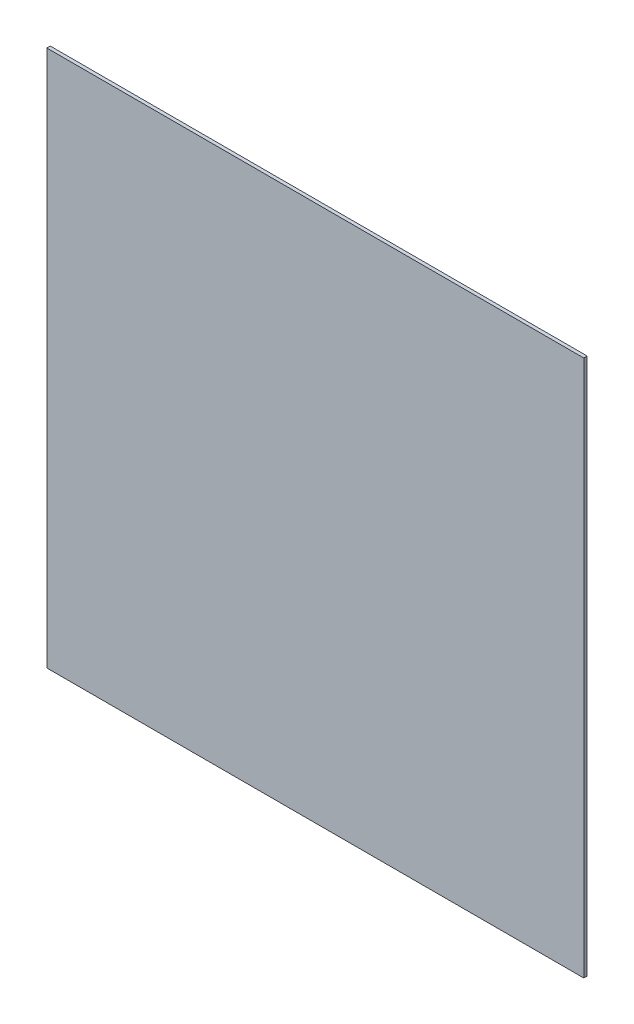
ISO-10303-21;
HEADER;
FILE_DESCRIPTION(('STEP AP214'),'2;1');
FILE_NAME('part.step','',(''),(''),'','','');
FILE_SCHEMA(('AUTOMOTIVE_DESIGN { 1 0 10303 214 1 1 1 1 }'));
ENDSEC;
DATA;
#1=APPLICATION_CONTEXT('core data for automotive mechanical design processes');
#2=APPLICATION_PROTOCOL_DEFINITION('international standard','automotive_design',2000,#1);
#3=PRODUCT_CONTEXT('',#1,'mechanical');
#4=PRODUCT('Part','Part','',(#3));
#5=PRODUCT_RELATED_PRODUCT_CATEGORY('part','',(#4));
#6=PRODUCT_DEFINITION_FORMATION('','',#4);
#7=PRODUCT_DEFINITION_CONTEXT('part definition',#1,'design');
#8=PRODUCT_DEFINITION('design','',#6,#7);
#9=PRODUCT_DEFINITION_SHAPE('','',#8);
#10=(LENGTH_UNIT() NAMED_UNIT(*) SI_UNIT(.MILLI.,.METRE.));
#11=(NAMED_UNIT(*) PLANE_ANGLE_UNIT() SI_UNIT($,.RADIAN.));
#12=(NAMED_UNIT(*) SI_UNIT($,.STERADIAN.) SOLID_ANGLE_UNIT());
#13=UNCERTAINTY_MEASURE_WITH_UNIT(LENGTH_MEASURE(1.E-05),#10,'distance_accuracy_value','');
#14=(GEOMETRIC_REPRESENTATION_CONTEXT(3) GLOBAL_UNCERTAINTY_ASSIGNED_CONTEXT((#13)) GLOBAL_UNIT_ASSIGNED_CONTEXT((#10,
#11,#12)) REPRESENTATION_CONTEXT('',''));
#15=CARTESIAN_POINT('',(0.,0.,0.));
#16=DIRECTION('',(0.,0.,1.));
#17=DIRECTION('',(1.,0.,0.));
#18=AXIS2_PLACEMENT_3D('',#15,#16,#17);
#19=CARTESIAN_POINT('',(1597.20489391915,-84.2433515912552,3.));
#20=DIRECTION('',(-1.,0.,0.));
#21=DIRECTION('',(0.,0.,1.));
#22=AXIS2_PLACEMENT_3D('',#19,#20,#21);
#23=PLANE('',#22);
#24=DIRECTION('',(0.,1.,0.));
#25=VECTOR('',#24,1.);
#26=CARTESIAN_POINT('',(1597.20489391915,-84.2433515912552,0.));
#27=LINE('',#26,#25);
#28=CARTESIAN_POINT('',(1597.20489391915,-554.143351591255,0.));
#29=VERTEX_POINT('',#28);
#30=CARTESIAN_POINT('',(1597.20489391915,-84.2433515912552,0.));
#31=VERTEX_POINT('',#30);
#32=EDGE_CURVE('E100',#29,#31,#27,.T.);
#33=ORIENTED_EDGE('',*,*,#32,.T.);
#34=DIRECTION('',(0.,0.,-1.));
#35=VECTOR('',#34,1.);
#36=CARTESIAN_POINT('',(1597.20489391915,-84.2433515912552,3.));
#37=LINE('',#36,#35);
#38=CARTESIAN_POINT('',(1597.20489391915,-84.2433515912552,3.));
#39=VERTEX_POINT('',#38);
#40=EDGE_CURVE('E11',#39,#31,#37,.T.);
#41=ORIENTED_EDGE('',*,*,#40,.F.);
#42=DIRECTION('',(0.,1.,0.));
#43=VECTOR('',#42,1.);
#44=CARTESIAN_POINT('',(1597.20489391915,-84.2433515912552,3.));
#45=LINE('',#44,#43);
#46=CARTESIAN_POINT('',(1597.20489391915,-554.143351591255,3.));
#47=VERTEX_POINT('',#46);
#48=EDGE_CURVE('E88',#47,#39,#45,.T.);
#49=ORIENTED_EDGE('',*,*,#48,.F.);
#50=DIRECTION('',(0.,0.,-1.));
#51=VECTOR('',#50,1.);
#52=CARTESIAN_POINT('',(1597.20489391915,-554.143351591255,3.));
#53=LINE('',#52,#51);
#54=EDGE_CURVE('E96',#47,#29,#53,.T.);
#55=ORIENTED_EDGE('',*,*,#54,.T.);
#56=EDGE_LOOP('',(#33,#41,#49,#55));
#57=FACE_BOUND('',#56,.T.);
#58=ADVANCED_FACE('F37',(#57),#23,.F.);
#59=CARTESIAN_POINT('',(1597.20489391915,-84.2433515912552,3.));
#60=DIRECTION('',(0.,-1.,0.));
#61=DIRECTION('',(0.,0.,-1.));
#62=AXIS2_PLACEMENT_3D('',#59,#60,#61);
#63=PLANE('',#62);
#64=DIRECTION('',(-1.,0.,0.));
#65=VECTOR('',#64,1.);
#66=CARTESIAN_POINT('',(1597.20489391915,-84.2433515912552,0.));
#67=LINE('',#66,#65);
#68=CARTESIAN_POINT('',(1127.30489391915,-84.2433515912552,0.));
#69=VERTEX_POINT('',#68);
#70=EDGE_CURVE('E92',#31,#69,#67,.T.);
#71=ORIENTED_EDGE('',*,*,#70,.T.);
#72=DIRECTION('',(0.,0.,-1.));
#73=VECTOR('',#72,1.);
#74=CARTESIAN_POINT('',(1127.30489391915,-84.2433515912552,3.));
#75=LINE('',#74,#73);
#76=CARTESIAN_POINT('',(1127.30489391915,-84.2433515912552,3.));
#77=VERTEX_POINT('',#76);
#78=EDGE_CURVE('E45',#77,#69,#75,.T.);
#79=ORIENTED_EDGE('',*,*,#78,.F.);
#80=DIRECTION('',(-1.,0.,0.));
#81=VECTOR('',#80,1.);
#82=CARTESIAN_POINT('',(1597.20489391915,-84.2433515912552,3.));
#83=LINE('',#82,#81);
#84=EDGE_CURVE('E83',#39,#77,#83,.T.);
#85=ORIENTED_EDGE('',*,*,#84,.F.);
#86=ORIENTED_EDGE('',*,*,#40,.T.);
#87=EDGE_LOOP('',(#71,#79,#85,#86));
#88=FACE_BOUND('',#87,.T.);
#89=ADVANCED_FACE('F91',(#88),#63,.F.);
#90=CARTESIAN_POINT('',(1127.30489391915,-84.2433515912552,3.));
#91=DIRECTION('',(1.,0.,0.));
#92=DIRECTION('',(0.,0.,-1.));
#93=AXIS2_PLACEMENT_3D('',#90,#91,#92);
#94=PLANE('',#93);
#95=DIRECTION('',(0.,-1.,0.));
#96=VECTOR('',#95,1.);
#97=CARTESIAN_POINT('',(1127.30489391915,-84.2433515912552,0.));
#98=LINE('',#97,#96);
#99=CARTESIAN_POINT('',(1127.30489391915,-554.143351591255,0.));
#100=VERTEX_POINT('',#99);
#101=EDGE_CURVE('E70',#69,#100,#98,.T.);
#102=ORIENTED_EDGE('',*,*,#101,.T.);
#103=DIRECTION('',(0.,0.,-1.));
#104=VECTOR('',#103,1.);
#105=CARTESIAN_POINT('',(1127.30489391915,-554.143351591255,3.));
#106=LINE('',#105,#104);
#107=CARTESIAN_POINT('',(1127.30489391915,-554.143351591255,3.));
#108=VERTEX_POINT('',#107);
#109=EDGE_CURVE('E93',#108,#100,#106,.T.);
#110=ORIENTED_EDGE('',*,*,#109,.F.);
#111=DIRECTION('',(0.,-1.,0.));
#112=VECTOR('',#111,1.);
#113=CARTESIAN_POINT('',(1127.30489391915,-84.2433515912552,3.));
#114=LINE('',#113,#112);
#115=EDGE_CURVE('E86',#77,#108,#114,.T.);
#116=ORIENTED_EDGE('',*,*,#115,.F.);
#117=ORIENTED_EDGE('',*,*,#78,.T.);
#118=EDGE_LOOP('',(#102,#110,#116,#117));
#119=FACE_BOUND('',#118,.T.);
#120=ADVANCED_FACE('F94',(#119),#94,.F.);
#121=CARTESIAN_POINT('',(1597.20489391915,-554.143351591255,3.));
#122=DIRECTION('',(0.,1.,0.));
#123=DIRECTION('',(-1.,0.,0.));
#124=AXIS2_PLACEMENT_3D('',#121,#122,#123);
#125=PLANE('',#124);
#126=DIRECTION('',(1.,0.,0.));
#127=VECTOR('',#126,1.);
#128=CARTESIAN_POINT('',(1597.20489391915,-554.143351591255,0.));
#129=LINE('',#128,#127);
#130=EDGE_CURVE('E76',#100,#29,#129,.T.);
#131=ORIENTED_EDGE('',*,*,#130,.T.);
#132=ORIENTED_EDGE('',*,*,#54,.F.);
#133=DIRECTION('',(1.,0.,0.));
#134=VECTOR('',#133,1.);
#135=CARTESIAN_POINT('',(1597.20489391915,-554.143351591255,3.));
#136=LINE('',#135,#134);
#137=EDGE_CURVE('E53',#108,#47,#136,.T.);
#138=ORIENTED_EDGE('',*,*,#137,.F.);
#139=ORIENTED_EDGE('',*,*,#109,.T.);
#140=EDGE_LOOP('',(#131,#132,#138,#139));
#141=FACE_BOUND('',#140,.T.);
#142=ADVANCED_FACE('F107',(#141),#125,.F.);
#143=CARTESIAN_POINT('',(0.,0.,3.));
#144=DIRECTION('',(0.,0.,-1.));
#145=DIRECTION('',(-1.,0.,0.));
#146=AXIS2_PLACEMENT_3D('',#143,#144,#145);
#147=PLANE('',#146);
#148=ORIENTED_EDGE('',*,*,#48,.T.);
#149=ORIENTED_EDGE('',*,*,#84,.T.);
#150=ORIENTED_EDGE('',*,*,#115,.T.);
#151=ORIENTED_EDGE('',*,*,#137,.T.);
#152=EDGE_LOOP('',(#148,#149,#150,#151));
#153=FACE_BOUND('',#152,.T.);
#154=ADVANCED_FACE('F84',(#153),#147,.F.);
#155=CARTESIAN_POINT('',(0.,0.,0.));
#156=DIRECTION('',(0.,0.,-1.));
#157=DIRECTION('',(-1.,0.,0.));
#158=AXIS2_PLACEMENT_3D('',#155,#156,#157);
#159=PLANE('',#158);
#160=ORIENTED_EDGE('',*,*,#32,.F.);
#161=ORIENTED_EDGE('',*,*,#130,.F.);
#162=ORIENTED_EDGE('',*,*,#101,.F.);
#163=ORIENTED_EDGE('',*,*,#70,.F.);
#164=EDGE_LOOP('',(#160,#161,#162,#163));
#165=FACE_BOUND('',#164,.T.);
#166=ADVANCED_FACE('F110',(#165),#159,.T.);
#167=CLOSED_SHELL('',(#58,#89,#120,#142,#154,#166));
#168=MANIFOLD_SOLID_BREP('B2',#167);
#169=ADVANCED_BREP_SHAPE_REPRESENTATION('',(#18,#168),#14);
#170=SHAPE_DEFINITION_REPRESENTATION(#9,#169);
ENDSEC;
END-ISO-10303-21;
